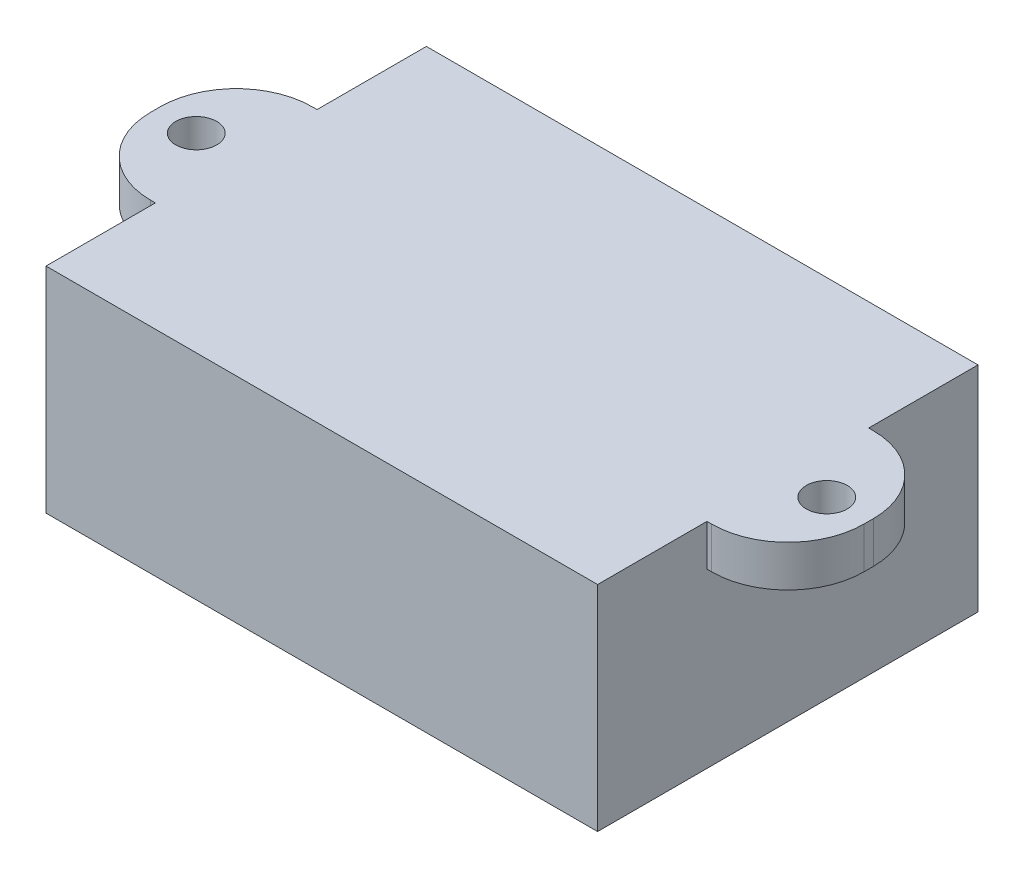
ISO-10303-21;
HEADER;
FILE_DESCRIPTION(('STEP AP214'),'2;1');
FILE_NAME('part.step','',(''),(''),'','','');
FILE_SCHEMA(('AUTOMOTIVE_DESIGN { 1 0 10303 214 1 1 1 1 }'));
ENDSEC;
DATA;
#1=APPLICATION_CONTEXT('core data for automotive mechanical design processes');
#2=APPLICATION_PROTOCOL_DEFINITION('international standard','automotive_design',2000,#1);
#3=PRODUCT_CONTEXT('',#1,'mechanical');
#4=PRODUCT('Part','Part','',(#3));
#5=PRODUCT_RELATED_PRODUCT_CATEGORY('part','',(#4));
#6=PRODUCT_DEFINITION_FORMATION('','',#4);
#7=PRODUCT_DEFINITION_CONTEXT('part definition',#1,'design');
#8=PRODUCT_DEFINITION('design','',#6,#7);
#9=PRODUCT_DEFINITION_SHAPE('','',#8);
#10=(LENGTH_UNIT() NAMED_UNIT(*) SI_UNIT(.MILLI.,.METRE.));
#11=(NAMED_UNIT(*) PLANE_ANGLE_UNIT() SI_UNIT($,.RADIAN.));
#12=(NAMED_UNIT(*) SI_UNIT($,.STERADIAN.) SOLID_ANGLE_UNIT());
#13=UNCERTAINTY_MEASURE_WITH_UNIT(LENGTH_MEASURE(1.E-05),#10,'distance_accuracy_value','');
#14=(GEOMETRIC_REPRESENTATION_CONTEXT(3) GLOBAL_UNCERTAINTY_ASSIGNED_CONTEXT((#13)) GLOBAL_UNIT_ASSIGNED_CONTEXT((#10,
#11,#12)) REPRESENTATION_CONTEXT('',''));
#15=CARTESIAN_POINT('',(0.,0.,0.));
#16=DIRECTION('',(0.,0.,1.));
#17=DIRECTION('',(1.,0.,0.));
#18=AXIS2_PLACEMENT_3D('',#15,#16,#17);
#19=CARTESIAN_POINT('',(0.,22.5,0.));
#20=DIRECTION('',(1.,0.,0.));
#21=DIRECTION('',(0.,0.,-1.));
#22=AXIS2_PLACEMENT_3D('',#19,#20,#21);
#23=PLANE('',#22);
#24=DIRECTION('',(0.,1.,0.));
#25=VECTOR('',#24,1.);
#26=CARTESIAN_POINT('',(0.,18.15,28.5));
#27=LINE('',#26,#25);
#28=CARTESIAN_POINT('',(0.,18.15,28.5));
#29=VERTEX_POINT('',#28);
#30=CARTESIAN_POINT('',(0.,22.5,28.5));
#31=VERTEX_POINT('',#30);
#32=EDGE_CURVE('E158',#29,#31,#27,.T.);
#33=ORIENTED_EDGE('',*,*,#32,.F.);
#34=DIRECTION('',(0.,0.,-1.));
#35=VECTOR('',#34,1.);
#36=CARTESIAN_POINT('',(0.,18.15,11.5));
#37=LINE('',#36,#35);
#38=CARTESIAN_POINT('',(0.,18.15,11.5));
#39=VERTEX_POINT('',#38);
#40=EDGE_CURVE('E165',#29,#39,#37,.T.);
#41=ORIENTED_EDGE('',*,*,#40,.T.);
#42=DIRECTION('',(0.,1.,0.));
#43=VECTOR('',#42,1.);
#44=CARTESIAN_POINT('',(0.,18.15,11.5));
#45=LINE('',#44,#43);
#46=CARTESIAN_POINT('',(0.,22.5,11.5));
#47=VERTEX_POINT('',#46);
#48=EDGE_CURVE('E146',#39,#47,#45,.T.);
#49=ORIENTED_EDGE('',*,*,#48,.T.);
#50=DIRECTION('',(0.,0.,1.));
#51=VECTOR('',#50,1.);
#52=CARTESIAN_POINT('',(0.,22.5,0.));
#53=LINE('',#52,#51);
#54=CARTESIAN_POINT('',(0.,22.5,0.));
#55=VERTEX_POINT('',#54);
#56=EDGE_CURVE('E221',#55,#47,#53,.T.);
#57=ORIENTED_EDGE('',*,*,#56,.F.);
#58=DIRECTION('',(0.,-1.,0.));
#59=VECTOR('',#58,1.);
#60=CARTESIAN_POINT('',(0.,22.5,0.));
#61=LINE('',#60,#59);
#62=CARTESIAN_POINT('',(0.,0.,0.));
#63=VERTEX_POINT('',#62);
#64=EDGE_CURVE('E232',#55,#63,#61,.T.);
#65=ORIENTED_EDGE('',*,*,#64,.T.);
#66=DIRECTION('',(0.,0.,1.));
#67=VECTOR('',#66,1.);
#68=CARTESIAN_POINT('',(0.,0.,0.));
#69=LINE('',#68,#67);
#70=CARTESIAN_POINT('',(0.,0.,40.));
#71=VERTEX_POINT('',#70);
#72=EDGE_CURVE('E218',#63,#71,#69,.T.);
#73=ORIENTED_EDGE('',*,*,#72,.T.);
#74=DIRECTION('',(0.,-1.,0.));
#75=VECTOR('',#74,1.);
#76=CARTESIAN_POINT('',(0.,22.5,40.));
#77=LINE('',#76,#75);
#78=CARTESIAN_POINT('',(0.,22.5,40.));
#79=VERTEX_POINT('',#78);
#80=EDGE_CURVE('E249',#79,#71,#77,.T.);
#81=ORIENTED_EDGE('',*,*,#80,.F.);
#82=EDGE_CURVE('E224',#31,#79,#53,.T.);
#83=ORIENTED_EDGE('',*,*,#82,.F.);
#84=EDGE_LOOP('',(#33,#41,#49,#57,#65,#73,#81,#83));
#85=FACE_BOUND('',#84,.T.);
#86=ADVANCED_FACE('F33',(#85),#23,.F.);
#87=CARTESIAN_POINT('',(58.,22.5,0.));
#88=DIRECTION('',(-1.,0.,0.));
#89=DIRECTION('',(0.,0.,1.));
#90=AXIS2_PLACEMENT_3D('',#87,#88,#89);
#91=PLANE('',#90);
#92=DIRECTION('',(0.,1.,0.));
#93=VECTOR('',#92,1.);
#94=CARTESIAN_POINT('',(58.,18.15,11.5));
#95=LINE('',#94,#93);
#96=CARTESIAN_POINT('',(58.,18.15,11.5));
#97=VERTEX_POINT('',#96);
#98=CARTESIAN_POINT('',(58.,22.5,11.5));
#99=VERTEX_POINT('',#98);
#100=EDGE_CURVE('E215',#97,#99,#95,.T.);
#101=ORIENTED_EDGE('',*,*,#100,.F.);
#102=DIRECTION('',(0.,0.,1.));
#103=VECTOR('',#102,1.);
#104=CARTESIAN_POINT('',(58.,18.15,11.5));
#105=LINE('',#104,#103);
#106=CARTESIAN_POINT('',(58.,18.15,28.5));
#107=VERTEX_POINT('',#106);
#108=EDGE_CURVE('E197',#97,#107,#105,.T.);
#109=ORIENTED_EDGE('',*,*,#108,.T.);
#110=DIRECTION('',(0.,1.,0.));
#111=VECTOR('',#110,1.);
#112=CARTESIAN_POINT('',(58.,18.15,28.5));
#113=LINE('',#112,#111);
#114=CARTESIAN_POINT('',(58.,22.5,28.5));
#115=VERTEX_POINT('',#114);
#116=EDGE_CURVE('E208',#107,#115,#113,.T.);
#117=ORIENTED_EDGE('',*,*,#116,.T.);
#118=DIRECTION('',(0.,0.,-1.));
#119=VECTOR('',#118,1.);
#120=CARTESIAN_POINT('',(58.,22.5,0.));
#121=LINE('',#120,#119);
#122=CARTESIAN_POINT('',(58.,22.5,40.));
#123=VERTEX_POINT('',#122);
#124=EDGE_CURVE('E227',#123,#115,#121,.T.);
#125=ORIENTED_EDGE('',*,*,#124,.F.);
#126=DIRECTION('',(0.,-1.,0.));
#127=VECTOR('',#126,1.);
#128=CARTESIAN_POINT('',(58.,22.5,40.));
#129=LINE('',#128,#127);
#130=CARTESIAN_POINT('',(58.,0.,40.));
#131=VERTEX_POINT('',#130);
#132=EDGE_CURVE('E246',#123,#131,#129,.T.);
#133=ORIENTED_EDGE('',*,*,#132,.T.);
#134=DIRECTION('',(0.,0.,-1.));
#135=VECTOR('',#134,1.);
#136=CARTESIAN_POINT('',(58.,0.,0.));
#137=LINE('',#136,#135);
#138=CARTESIAN_POINT('',(58.,0.,0.));
#139=VERTEX_POINT('',#138);
#140=EDGE_CURVE('E237',#131,#139,#137,.T.);
#141=ORIENTED_EDGE('',*,*,#140,.T.);
#142=DIRECTION('',(0.,-1.,0.));
#143=VECTOR('',#142,1.);
#144=CARTESIAN_POINT('',(58.,22.5,0.));
#145=LINE('',#144,#143);
#146=CARTESIAN_POINT('',(58.,22.5,0.));
#147=VERTEX_POINT('',#146);
#148=EDGE_CURVE('E243',#147,#139,#145,.T.);
#149=ORIENTED_EDGE('',*,*,#148,.F.);
#150=EDGE_CURVE('E226',#99,#147,#121,.T.);
#151=ORIENTED_EDGE('',*,*,#150,.F.);
#152=EDGE_LOOP('',(#101,#109,#117,#125,#133,#141,#149,#151));
#153=FACE_BOUND('',#152,.T.);
#154=ADVANCED_FACE('F303',(#153),#91,.F.);
#155=CARTESIAN_POINT('',(0.,22.5,40.));
#156=DIRECTION('',(0.,0.,-1.));
#157=DIRECTION('',(-1.,0.,0.));
#158=AXIS2_PLACEMENT_3D('',#155,#156,#157);
#159=PLANE('',#158);
#160=DIRECTION('',(1.,0.,0.));
#161=VECTOR('',#160,1.);
#162=CARTESIAN_POINT('',(0.,0.,40.));
#163=LINE('',#162,#161);
#164=EDGE_CURVE('E235',#71,#131,#163,.T.);
#165=ORIENTED_EDGE('',*,*,#164,.T.);
#166=ORIENTED_EDGE('',*,*,#132,.F.);
#167=DIRECTION('',(1.,0.,0.));
#168=VECTOR('',#167,1.);
#169=CARTESIAN_POINT('',(0.,22.5,40.));
#170=LINE('',#169,#168);
#171=EDGE_CURVE('E223',#79,#123,#170,.T.);
#172=ORIENTED_EDGE('',*,*,#171,.F.);
#173=ORIENTED_EDGE('',*,*,#80,.T.);
#174=EDGE_LOOP('',(#165,#166,#172,#173));
#175=FACE_BOUND('',#174,.T.);
#176=ADVANCED_FACE('F317',(#175),#159,.F.);
#177=CARTESIAN_POINT('',(0.,22.5,0.));
#178=DIRECTION('',(0.,0.,1.));
#179=DIRECTION('',(1.,0.,0.));
#180=AXIS2_PLACEMENT_3D('',#177,#178,#179);
#181=PLANE('',#180);
#182=DIRECTION('',(-1.,0.,0.));
#183=VECTOR('',#182,1.);
#184=CARTESIAN_POINT('',(0.,0.,0.));
#185=LINE('',#184,#183);
#186=EDGE_CURVE('E239',#139,#63,#185,.T.);
#187=ORIENTED_EDGE('',*,*,#186,.T.);
#188=ORIENTED_EDGE('',*,*,#64,.F.);
#189=DIRECTION('',(-1.,0.,0.));
#190=VECTOR('',#189,1.);
#191=CARTESIAN_POINT('',(0.,22.5,0.));
#192=LINE('',#191,#190);
#193=EDGE_CURVE('E230',#147,#55,#192,.T.);
#194=ORIENTED_EDGE('',*,*,#193,.F.);
#195=ORIENTED_EDGE('',*,*,#148,.T.);
#196=EDGE_LOOP('',(#187,#188,#194,#195));
#197=FACE_BOUND('',#196,.T.);
#198=ADVANCED_FACE('F307',(#197),#181,.F.);
#199=CARTESIAN_POINT('',(0.,22.5,0.));
#200=DIRECTION('',(0.,1.,0.));
#201=DIRECTION('',(0.,0.,1.));
#202=AXIS2_PLACEMENT_3D('',#199,#200,#201);
#203=PLANE('',#202);
#204=DIRECTION('',(0.,0.,1.));
#205=VECTOR('',#204,1.);
#206=CARTESIAN_POINT('',(-8.5,22.5,11.5));
#207=LINE('',#206,#205);
#208=CARTESIAN_POINT('',(-8.5,22.5,19.5));
#209=VERTEX_POINT('',#208);
#210=CARTESIAN_POINT('',(-8.5,22.5,20.5));
#211=VERTEX_POINT('',#210);
#212=EDGE_CURVE('E176',#209,#211,#207,.T.);
#213=ORIENTED_EDGE('',*,*,#212,.T.);
#214=CARTESIAN_POINT('',(-0.500000000000002,22.5,20.5));
#215=DIRECTION('',(0.,1.,0.));
#216=DIRECTION('',(0.,0.,1.));
#217=AXIS2_PLACEMENT_3D('',#214,#215,#216);
#218=CIRCLE('',#217,8.);
#219=CARTESIAN_POINT('',(-0.500000000000002,22.5,28.5));
#220=VERTEX_POINT('',#219);
#221=EDGE_CURVE('E263',#211,#220,#218,.T.);
#222=ORIENTED_EDGE('',*,*,#221,.T.);
#223=DIRECTION('',(1.,0.,0.));
#224=VECTOR('',#223,1.);
#225=CARTESIAN_POINT('',(0.,22.5,28.5));
#226=LINE('',#225,#224);
#227=EDGE_CURVE('E174',#220,#31,#226,.T.);
#228=ORIENTED_EDGE('',*,*,#227,.T.);
#229=ORIENTED_EDGE('',*,*,#82,.T.);
#230=ORIENTED_EDGE('',*,*,#171,.T.);
#231=ORIENTED_EDGE('',*,*,#124,.T.);
#232=DIRECTION('',(1.,0.,0.));
#233=VECTOR('',#232,1.);
#234=CARTESIAN_POINT('',(58.,22.5,28.5));
#235=LINE('',#234,#233);
#236=CARTESIAN_POINT('',(58.5,22.5,28.5));
#237=VERTEX_POINT('',#236);
#238=EDGE_CURVE('E194',#115,#237,#235,.T.);
#239=ORIENTED_EDGE('',*,*,#238,.T.);
#240=CARTESIAN_POINT('',(58.5,22.5,20.5));
#241=DIRECTION('',(0.,1.,0.));
#242=DIRECTION('',(0.,0.,1.));
#243=AXIS2_PLACEMENT_3D('',#240,#241,#242);
#244=CIRCLE('',#243,8.);
#245=CARTESIAN_POINT('',(66.5,22.5,20.5));
#246=VERTEX_POINT('',#245);
#247=EDGE_CURVE('E259',#237,#246,#244,.T.);
#248=ORIENTED_EDGE('',*,*,#247,.T.);
#249=DIRECTION('',(0.,0.,-1.));
#250=VECTOR('',#249,1.);
#251=CARTESIAN_POINT('',(66.5,22.5,11.5));
#252=LINE('',#251,#250);
#253=CARTESIAN_POINT('',(66.5,22.5,19.5));
#254=VERTEX_POINT('',#253);
#255=EDGE_CURVE('E211',#246,#254,#252,.T.);
#256=ORIENTED_EDGE('',*,*,#255,.T.);
#257=CARTESIAN_POINT('',(58.5,22.5,19.5));
#258=DIRECTION('',(0.,1.,0.));
#259=DIRECTION('',(0.,0.,1.));
#260=AXIS2_PLACEMENT_3D('',#257,#258,#259);
#261=CIRCLE('',#260,8.);
#262=CARTESIAN_POINT('',(58.5,22.5,11.5));
#263=VERTEX_POINT('',#262);
#264=EDGE_CURVE('E257',#254,#263,#261,.T.);
#265=ORIENTED_EDGE('',*,*,#264,.T.);
#266=DIRECTION('',(-1.,0.,0.));
#267=VECTOR('',#266,1.);
#268=CARTESIAN_POINT('',(58.,22.5,11.5));
#269=LINE('',#268,#267);
#270=EDGE_CURVE('E201',#263,#99,#269,.T.);
#271=ORIENTED_EDGE('',*,*,#270,.T.);
#272=ORIENTED_EDGE('',*,*,#150,.T.);
#273=ORIENTED_EDGE('',*,*,#193,.T.);
#274=ORIENTED_EDGE('',*,*,#56,.T.);
#275=DIRECTION('',(-1.,0.,0.));
#276=VECTOR('',#275,1.);
#277=CARTESIAN_POINT('',(0.,22.5,11.5));
#278=LINE('',#277,#276);
#279=CARTESIAN_POINT('',(-0.500000000000002,22.5,11.5));
#280=VERTEX_POINT('',#279);
#281=EDGE_CURVE('E153',#47,#280,#278,.T.);
#282=ORIENTED_EDGE('',*,*,#281,.T.);
#283=CARTESIAN_POINT('',(-0.500000000000002,22.5,19.5));
#284=DIRECTION('',(0.,1.,0.));
#285=DIRECTION('',(0.,0.,1.));
#286=AXIS2_PLACEMENT_3D('',#283,#284,#285);
#287=CIRCLE('',#286,8.);
#288=EDGE_CURVE('E261',#280,#209,#287,.T.);
#289=ORIENTED_EDGE('',*,*,#288,.T.);
#290=EDGE_LOOP('',(#213,#222,#228,#229,#230,#231,#239,#248,#256,#265,#271,#272,#273,#274,#282,#289));
#291=FACE_BOUND('',#290,.T.);
#292=CARTESIAN_POINT('',(62.1,22.5,20.));
#293=DIRECTION('',(0.,1.,0.));
#294=DIRECTION('',(0.,0.,1.));
#295=AXIS2_PLACEMENT_3D('',#292,#293,#294);
#296=CIRCLE('',#295,2.15000000000002);
#297=CARTESIAN_POINT('',(62.1,22.5,22.15));
#298=VERTEX_POINT('',#297);
#299=EDGE_CURVE('E189',#298,#298,#296,.T.);
#300=ORIENTED_EDGE('',*,*,#299,.F.);
#301=EDGE_LOOP('',(#300));
#302=FACE_BOUND('',#301,.T.);
#303=CARTESIAN_POINT('',(-4.2,22.5,20.));
#304=DIRECTION('',(0.,1.,0.));
#305=DIRECTION('',(0.,0.,1.));
#306=AXIS2_PLACEMENT_3D('',#303,#304,#305);
#307=CIRCLE('',#306,2.15);
#308=CARTESIAN_POINT('',(-4.2,22.5,22.15));
#309=VERTEX_POINT('',#308);
#310=EDGE_CURVE('E179',#309,#309,#307,.T.);
#311=ORIENTED_EDGE('',*,*,#310,.F.);
#312=EDGE_LOOP('',(#311));
#313=FACE_BOUND('',#312,.T.);
#314=ADVANCED_FACE('F292',(#291,#302,#313),#203,.T.);
#315=CARTESIAN_POINT('',(0.,0.,0.));
#316=DIRECTION('',(0.,1.,0.));
#317=DIRECTION('',(0.,0.,1.));
#318=AXIS2_PLACEMENT_3D('',#315,#316,#317);
#319=PLANE('',#318);
#320=ORIENTED_EDGE('',*,*,#72,.F.);
#321=ORIENTED_EDGE('',*,*,#186,.F.);
#322=ORIENTED_EDGE('',*,*,#140,.F.);
#323=ORIENTED_EDGE('',*,*,#164,.F.);
#324=EDGE_LOOP('',(#320,#321,#322,#323));
#325=FACE_BOUND('',#324,.T.);
#326=ADVANCED_FACE('F312',(#325),#319,.F.);
#327=CARTESIAN_POINT('',(58.,18.15,11.5));
#328=DIRECTION('',(0.,0.,-1.));
#329=DIRECTION('',(-1.,0.,0.));
#330=AXIS2_PLACEMENT_3D('',#327,#328,#329);
#331=PLANE('',#330);
#332=ORIENTED_EDGE('',*,*,#270,.F.);
#333=DIRECTION('',(0.,1.,0.));
#334=VECTOR('',#333,1.);
#335=CARTESIAN_POINT('',(58.5,18.15,11.5));
#336=LINE('',#335,#334);
#337=CARTESIAN_POINT('',(58.5,18.15,11.5));
#338=VERTEX_POINT('',#337);
#339=EDGE_CURVE('E11',#263,#338,#336,.F.);
#340=ORIENTED_EDGE('',*,*,#339,.T.);
#341=DIRECTION('',(-1.,0.,0.));
#342=VECTOR('',#341,1.);
#343=CARTESIAN_POINT('',(58.,18.15,11.5));
#344=LINE('',#343,#342);
#345=EDGE_CURVE('E206',#338,#97,#344,.T.);
#346=ORIENTED_EDGE('',*,*,#345,.T.);
#347=ORIENTED_EDGE('',*,*,#100,.T.);
#348=EDGE_LOOP('',(#332,#340,#346,#347));
#349=FACE_BOUND('',#348,.T.);
#350=ADVANCED_FACE('F298',(#349),#331,.T.);
#351=CARTESIAN_POINT('',(66.5,18.15,11.5));
#352=DIRECTION('',(1.,0.,0.));
#353=DIRECTION('',(0.,0.,-1.));
#354=AXIS2_PLACEMENT_3D('',#351,#352,#353);
#355=PLANE('',#354);
#356=ORIENTED_EDGE('',*,*,#255,.F.);
#357=DIRECTION('',(0.,1.,0.));
#358=VECTOR('',#357,1.);
#359=CARTESIAN_POINT('',(66.5,18.15,20.5));
#360=LINE('',#359,#358);
#361=CARTESIAN_POINT('',(66.5,18.15,20.5));
#362=VERTEX_POINT('',#361);
#363=EDGE_CURVE('E278',#246,#362,#360,.F.);
#364=ORIENTED_EDGE('',*,*,#363,.T.);
#365=DIRECTION('',(0.,0.,-1.));
#366=VECTOR('',#365,1.);
#367=CARTESIAN_POINT('',(66.5,18.15,11.5));
#368=LINE('',#367,#366);
#369=CARTESIAN_POINT('',(66.5,18.15,19.5));
#370=VERTEX_POINT('',#369);
#371=EDGE_CURVE('E204',#362,#370,#368,.T.);
#372=ORIENTED_EDGE('',*,*,#371,.T.);
#373=DIRECTION('',(0.,1.,0.));
#374=VECTOR('',#373,1.);
#375=CARTESIAN_POINT('',(66.5,18.15,19.5));
#376=LINE('',#375,#374);
#377=EDGE_CURVE('E275',#370,#254,#376,.T.);
#378=ORIENTED_EDGE('',*,*,#377,.T.);
#379=EDGE_LOOP('',(#356,#364,#372,#378));
#380=FACE_BOUND('',#379,.T.);
#381=ADVANCED_FACE('F295',(#380),#355,.T.);
#382=CARTESIAN_POINT('',(58.,18.15,28.5));
#383=DIRECTION('',(0.,0.,1.));
#384=DIRECTION('',(1.,0.,0.));
#385=AXIS2_PLACEMENT_3D('',#382,#383,#384);
#386=PLANE('',#385);
#387=DIRECTION('',(1.,0.,0.));
#388=VECTOR('',#387,1.);
#389=CARTESIAN_POINT('',(58.,18.15,28.5));
#390=LINE('',#389,#388);
#391=CARTESIAN_POINT('',(58.5,18.15,28.5));
#392=VERTEX_POINT('',#391);
#393=EDGE_CURVE('E200',#107,#392,#390,.T.);
#394=ORIENTED_EDGE('',*,*,#393,.T.);
#395=DIRECTION('',(0.,1.,0.));
#396=VECTOR('',#395,1.);
#397=CARTESIAN_POINT('',(58.5,18.15,28.5));
#398=LINE('',#397,#396);
#399=EDGE_CURVE('E272',#392,#237,#398,.T.);
#400=ORIENTED_EDGE('',*,*,#399,.T.);
#401=ORIENTED_EDGE('',*,*,#238,.F.);
#402=ORIENTED_EDGE('',*,*,#116,.F.);
#403=EDGE_LOOP('',(#394,#400,#401,#402));
#404=FACE_BOUND('',#403,.T.);
#405=ADVANCED_FACE('F288',(#404),#386,.T.);
#406=CARTESIAN_POINT('',(0.,18.15,0.));
#407=DIRECTION('',(0.,1.,0.));
#408=DIRECTION('',(0.,0.,1.));
#409=AXIS2_PLACEMENT_3D('',#406,#407,#408);
#410=PLANE('',#409);
#411=CARTESIAN_POINT('',(62.1,18.15,20.));
#412=DIRECTION('',(0.,1.,0.));
#413=DIRECTION('',(0.,0.,1.));
#414=AXIS2_PLACEMENT_3D('',#411,#412,#413);
#415=CIRCLE('',#414,2.15000000000002);
#416=CARTESIAN_POINT('',(62.1,18.15,22.15));
#417=VERTEX_POINT('',#416);
#418=EDGE_CURVE('E191',#417,#417,#415,.T.);
#419=ORIENTED_EDGE('',*,*,#418,.T.);
#420=EDGE_LOOP('',(#419));
#421=FACE_BOUND('',#420,.T.);
#422=ORIENTED_EDGE('',*,*,#371,.F.);
#423=CARTESIAN_POINT('',(58.5,18.15,20.5));
#424=DIRECTION('',(0.,1.,0.));
#425=DIRECTION('',(0.,0.,1.));
#426=AXIS2_PLACEMENT_3D('',#423,#424,#425);
#427=CIRCLE('',#426,8.);
#428=EDGE_CURVE('E41',#362,#392,#427,.F.);
#429=ORIENTED_EDGE('',*,*,#428,.T.);
#430=ORIENTED_EDGE('',*,*,#393,.F.);
#431=ORIENTED_EDGE('',*,*,#108,.F.);
#432=ORIENTED_EDGE('',*,*,#345,.F.);
#433=CARTESIAN_POINT('',(58.5,18.15,19.5));
#434=DIRECTION('',(0.,1.,0.));
#435=DIRECTION('',(0.,0.,1.));
#436=AXIS2_PLACEMENT_3D('',#433,#434,#435);
#437=CIRCLE('',#436,8.);
#438=EDGE_CURVE('E53',#338,#370,#437,.F.);
#439=ORIENTED_EDGE('',*,*,#438,.T.);
#440=EDGE_LOOP('',(#422,#429,#430,#431,#432,#439));
#441=FACE_BOUND('',#440,.T.);
#442=ADVANCED_FACE('F282',(#421,#441),#410,.F.);
#443=CARTESIAN_POINT('',(62.1,18.15,20.));
#444=DIRECTION('',(0.,1.,0.));
#445=DIRECTION('',(0.,0.,1.));
#446=AXIS2_PLACEMENT_3D('',#443,#444,#445);
#447=CYLINDRICAL_SURFACE('',#446,2.15000000000002);
#448=ORIENTED_EDGE('',*,*,#418,.F.);
#449=EDGE_LOOP('',(#448));
#450=FACE_BOUND('',#449,.T.);
#451=ORIENTED_EDGE('',*,*,#299,.T.);
#452=EDGE_LOOP('',(#451));
#453=FACE_BOUND('',#452,.T.);
#454=ADVANCED_FACE('F363',(#450,#453),#447,.F.);
#455=CARTESIAN_POINT('',(0.,18.15,28.5));
#456=DIRECTION('',(0.,0.,1.));
#457=DIRECTION('',(1.,0.,0.));
#458=AXIS2_PLACEMENT_3D('',#455,#456,#457);
#459=PLANE('',#458);
#460=ORIENTED_EDGE('',*,*,#227,.F.);
#461=DIRECTION('',(0.,1.,0.));
#462=VECTOR('',#461,1.);
#463=CARTESIAN_POINT('',(-0.500000000000002,18.15,28.5));
#464=LINE('',#463,#462);
#465=CARTESIAN_POINT('',(-0.500000000000002,18.15,28.5));
#466=VERTEX_POINT('',#465);
#467=EDGE_CURVE('E265',#220,#466,#464,.F.);
#468=ORIENTED_EDGE('',*,*,#467,.T.);
#469=DIRECTION('',(1.,0.,0.));
#470=VECTOR('',#469,1.);
#471=CARTESIAN_POINT('',(0.,18.15,28.5));
#472=LINE('',#471,#470);
#473=EDGE_CURVE('E159',#466,#29,#472,.T.);
#474=ORIENTED_EDGE('',*,*,#473,.T.);
#475=ORIENTED_EDGE('',*,*,#32,.T.);
#476=EDGE_LOOP('',(#460,#468,#474,#475));
#477=FACE_BOUND('',#476,.T.);
#478=ADVANCED_FACE('F321',(#477),#459,.T.);
#479=CARTESIAN_POINT('',(-8.5,18.15,11.5));
#480=DIRECTION('',(-1.,0.,0.));
#481=DIRECTION('',(0.,0.,1.));
#482=AXIS2_PLACEMENT_3D('',#479,#480,#481);
#483=PLANE('',#482);
#484=DIRECTION('',(0.,0.,1.));
#485=VECTOR('',#484,1.);
#486=CARTESIAN_POINT('',(-8.5,18.15,11.5));
#487=LINE('',#486,#485);
#488=CARTESIAN_POINT('',(-8.5,18.15,19.5));
#489=VERTEX_POINT('',#488);
#490=CARTESIAN_POINT('',(-8.5,18.15,20.5));
#491=VERTEX_POINT('',#490);
#492=EDGE_CURVE('E170',#489,#491,#487,.T.);
#493=ORIENTED_EDGE('',*,*,#492,.T.);
#494=DIRECTION('',(0.,1.,0.));
#495=VECTOR('',#494,1.);
#496=CARTESIAN_POINT('',(-8.5,18.15,20.5));
#497=LINE('',#496,#495);
#498=EDGE_CURVE('E254',#491,#211,#497,.T.);
#499=ORIENTED_EDGE('',*,*,#498,.T.);
#500=ORIENTED_EDGE('',*,*,#212,.F.);
#501=DIRECTION('',(0.,1.,0.));
#502=VECTOR('',#501,1.);
#503=CARTESIAN_POINT('',(-8.5,18.15,19.5));
#504=LINE('',#503,#502);
#505=EDGE_CURVE('E252',#209,#489,#504,.F.);
#506=ORIENTED_EDGE('',*,*,#505,.T.);
#507=EDGE_LOOP('',(#493,#499,#500,#506));
#508=FACE_BOUND('',#507,.T.);
#509=ADVANCED_FACE('F328',(#508),#483,.T.);
#510=CARTESIAN_POINT('',(0.,18.15,11.5));
#511=DIRECTION('',(0.,0.,-1.));
#512=DIRECTION('',(-1.,0.,0.));
#513=AXIS2_PLACEMENT_3D('',#510,#511,#512);
#514=PLANE('',#513);
#515=DIRECTION('',(-1.,0.,0.));
#516=VECTOR('',#515,1.);
#517=CARTESIAN_POINT('',(0.,18.15,11.5));
#518=LINE('',#517,#516);
#519=CARTESIAN_POINT('',(-0.500000000000002,18.15,11.5));
#520=VERTEX_POINT('',#519);
#521=EDGE_CURVE('E150',#39,#520,#518,.T.);
#522=ORIENTED_EDGE('',*,*,#521,.T.);
#523=DIRECTION('',(0.,1.,0.));
#524=VECTOR('',#523,1.);
#525=CARTESIAN_POINT('',(-0.500000000000002,18.15,11.5));
#526=LINE('',#525,#524);
#527=EDGE_CURVE('E270',#520,#280,#526,.T.);
#528=ORIENTED_EDGE('',*,*,#527,.T.);
#529=ORIENTED_EDGE('',*,*,#281,.F.);
#530=ORIENTED_EDGE('',*,*,#48,.F.);
#531=EDGE_LOOP('',(#522,#528,#529,#530));
#532=FACE_BOUND('',#531,.T.);
#533=ADVANCED_FACE('F148',(#532),#514,.T.);
#534=CARTESIAN_POINT('',(0.,18.15,0.));
#535=DIRECTION('',(0.,-1.,0.));
#536=DIRECTION('',(0.,0.,-1.));
#537=AXIS2_PLACEMENT_3D('',#534,#535,#536);
#538=PLANE('',#537);
#539=CARTESIAN_POINT('',(-4.2,18.15,20.));
#540=DIRECTION('',(0.,1.,0.));
#541=DIRECTION('',(0.,0.,1.));
#542=AXIS2_PLACEMENT_3D('',#539,#540,#541);
#543=CIRCLE('',#542,2.15);
#544=CARTESIAN_POINT('',(-4.2,18.15,22.15));
#545=VERTEX_POINT('',#544);
#546=EDGE_CURVE('E186',#545,#545,#543,.T.);
#547=ORIENTED_EDGE('',*,*,#546,.T.);
#548=EDGE_LOOP('',(#547));
#549=FACE_BOUND('',#548,.T.);
#550=ORIENTED_EDGE('',*,*,#473,.F.);
#551=CARTESIAN_POINT('',(-0.500000000000002,18.15,20.5));
#552=DIRECTION('',(0.,-1.,0.));
#553=DIRECTION('',(0.,0.,-1.));
#554=AXIS2_PLACEMENT_3D('',#551,#552,#553);
#555=CIRCLE('',#554,8.);
#556=EDGE_CURVE('E268',#466,#491,#555,.T.);
#557=ORIENTED_EDGE('',*,*,#556,.T.);
#558=ORIENTED_EDGE('',*,*,#492,.F.);
#559=CARTESIAN_POINT('',(-0.500000000000002,18.15,19.5));
#560=DIRECTION('',(0.,-1.,0.));
#561=DIRECTION('',(0.,0.,-1.));
#562=AXIS2_PLACEMENT_3D('',#559,#560,#561);
#563=CIRCLE('',#562,8.);
#564=EDGE_CURVE('E169',#489,#520,#563,.T.);
#565=ORIENTED_EDGE('',*,*,#564,.T.);
#566=ORIENTED_EDGE('',*,*,#521,.F.);
#567=ORIENTED_EDGE('',*,*,#40,.F.);
#568=EDGE_LOOP('',(#550,#557,#558,#565,#566,#567));
#569=FACE_BOUND('',#568,.T.);
#570=ADVANCED_FACE('F164',(#549,#569),#538,.T.);
#571=CARTESIAN_POINT('',(-4.2,18.15,20.));
#572=DIRECTION('',(0.,1.,0.));
#573=DIRECTION('',(0.,0.,1.));
#574=AXIS2_PLACEMENT_3D('',#571,#572,#573);
#575=CYLINDRICAL_SURFACE('',#574,2.15);
#576=ORIENTED_EDGE('',*,*,#546,.F.);
#577=EDGE_LOOP('',(#576));
#578=FACE_BOUND('',#577,.T.);
#579=ORIENTED_EDGE('',*,*,#310,.T.);
#580=EDGE_LOOP('',(#579));
#581=FACE_BOUND('',#580,.T.);
#582=ADVANCED_FACE('F338',(#578,#581),#575,.F.);
#583=CARTESIAN_POINT('',(-0.500000000000002,18.15,20.5));
#584=DIRECTION('',(0.,1.,0.));
#585=DIRECTION('',(0.,0.,1.));
#586=AXIS2_PLACEMENT_3D('',#583,#584,#585);
#587=CYLINDRICAL_SURFACE('',#586,8.);
#588=ORIENTED_EDGE('',*,*,#556,.F.);
#589=ORIENTED_EDGE('',*,*,#467,.F.);
#590=ORIENTED_EDGE('',*,*,#221,.F.);
#591=ORIENTED_EDGE('',*,*,#498,.F.);
#592=EDGE_LOOP('',(#588,#589,#590,#591));
#593=FACE_BOUND('',#592,.T.);
#594=ADVANCED_FACE('F325',(#593),#587,.T.);
#595=CARTESIAN_POINT('',(-0.500000000000002,18.15,19.5));
#596=DIRECTION('',(0.,1.,0.));
#597=DIRECTION('',(0.,0.,1.));
#598=AXIS2_PLACEMENT_3D('',#595,#596,#597);
#599=CYLINDRICAL_SURFACE('',#598,8.);
#600=ORIENTED_EDGE('',*,*,#564,.F.);
#601=ORIENTED_EDGE('',*,*,#505,.F.);
#602=ORIENTED_EDGE('',*,*,#288,.F.);
#603=ORIENTED_EDGE('',*,*,#527,.F.);
#604=EDGE_LOOP('',(#600,#601,#602,#603));
#605=FACE_BOUND('',#604,.T.);
#606=ADVANCED_FACE('F331',(#605),#599,.T.);
#607=CARTESIAN_POINT('',(58.5,18.15,20.5));
#608=DIRECTION('',(0.,1.,0.));
#609=DIRECTION('',(0.,0.,1.));
#610=AXIS2_PLACEMENT_3D('',#607,#608,#609);
#611=CYLINDRICAL_SURFACE('',#610,8.);
#612=ORIENTED_EDGE('',*,*,#428,.F.);
#613=ORIENTED_EDGE('',*,*,#363,.F.);
#614=ORIENTED_EDGE('',*,*,#247,.F.);
#615=ORIENTED_EDGE('',*,*,#399,.F.);
#616=EDGE_LOOP('',(#612,#613,#614,#615));
#617=FACE_BOUND('',#616,.T.);
#618=ADVANCED_FACE('F289',(#617),#611,.T.);
#619=CARTESIAN_POINT('',(58.5,18.15,19.5));
#620=DIRECTION('',(0.,1.,0.));
#621=DIRECTION('',(0.,0.,1.));
#622=AXIS2_PLACEMENT_3D('',#619,#620,#621);
#623=CYLINDRICAL_SURFACE('',#622,8.);
#624=ORIENTED_EDGE('',*,*,#438,.F.);
#625=ORIENTED_EDGE('',*,*,#339,.F.);
#626=ORIENTED_EDGE('',*,*,#264,.F.);
#627=ORIENTED_EDGE('',*,*,#377,.F.);
#628=EDGE_LOOP('',(#624,#625,#626,#627));
#629=FACE_BOUND('',#628,.T.);
#630=ADVANCED_FACE('F35',(#629),#623,.T.);
#631=CLOSED_SHELL('',(#86,#154,#176,#198,#314,#326,#350,#381,#405,#442,#454,#478,#509,#533,#570,
#582,#594,#606,#618,#630));
#632=MANIFOLD_SOLID_BREP('B2',#631);
#633=ADVANCED_BREP_SHAPE_REPRESENTATION('',(#18,#632),#14);
#634=SHAPE_DEFINITION_REPRESENTATION(#9,#633);
ENDSEC;
END-ISO-10303-21;
